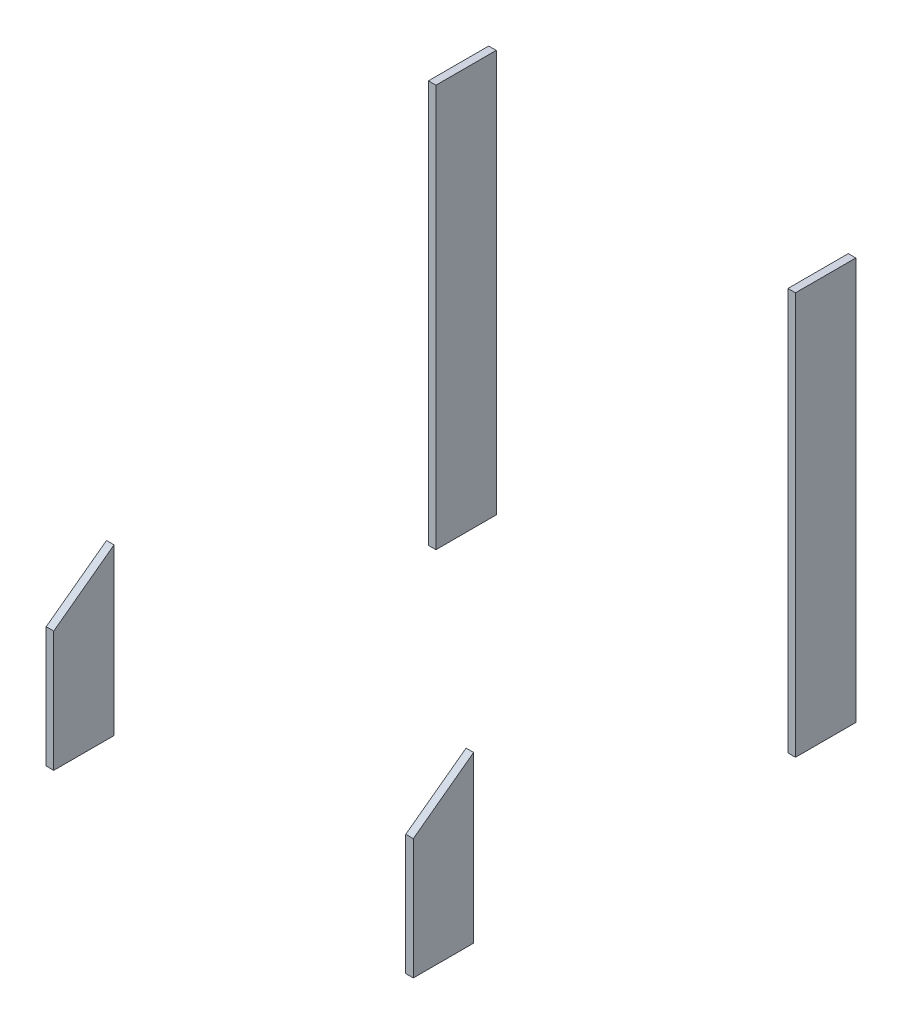
ISO-10303-21;
HEADER;
FILE_DESCRIPTION(('STEP AP214'),'2;1');
FILE_NAME('part.step','',(''),(''),'','','');
FILE_SCHEMA(('AUTOMOTIVE_DESIGN { 1 0 10303 214 1 1 1 1 }'));
ENDSEC;
DATA;
#1=APPLICATION_CONTEXT('core data for automotive mechanical design processes');
#2=APPLICATION_PROTOCOL_DEFINITION('international standard','automotive_design',2000,#1);
#3=PRODUCT_CONTEXT('',#1,'mechanical');
#4=PRODUCT('Part','Part','',(#3));
#5=PRODUCT_RELATED_PRODUCT_CATEGORY('part','',(#4));
#6=PRODUCT_DEFINITION_FORMATION('','',#4);
#7=PRODUCT_DEFINITION_CONTEXT('part definition',#1,'design');
#8=PRODUCT_DEFINITION('design','',#6,#7);
#9=PRODUCT_DEFINITION_SHAPE('','',#8);
#10=(LENGTH_UNIT() NAMED_UNIT(*) SI_UNIT(.MILLI.,.METRE.));
#11=(NAMED_UNIT(*) PLANE_ANGLE_UNIT() SI_UNIT($,.RADIAN.));
#12=(NAMED_UNIT(*) SI_UNIT($,.STERADIAN.) SOLID_ANGLE_UNIT());
#13=UNCERTAINTY_MEASURE_WITH_UNIT(LENGTH_MEASURE(1.E-05),#10,'distance_accuracy_value','');
#14=(GEOMETRIC_REPRESENTATION_CONTEXT(3) GLOBAL_UNCERTAINTY_ASSIGNED_CONTEXT((#13)) GLOBAL_UNIT_ASSIGNED_CONTEXT((#10,
#11,#12)) REPRESENTATION_CONTEXT('',''));
#15=CARTESIAN_POINT('',(0.,0.,0.));
#16=DIRECTION('',(0.,0.,1.));
#17=DIRECTION('',(1.,0.,0.));
#18=AXIS2_PLACEMENT_3D('',#15,#16,#17);
#19=CARTESIAN_POINT('',(231.775,254.,279.4));
#20=DIRECTION('',(-1.,0.,0.));
#21=DIRECTION('',(0.,0.,1.));
#22=AXIS2_PLACEMENT_3D('',#19,#20,#21);
#23=PLANE('',#22);
#24=DIRECTION('',(0.,0.59319903804985,-0.805055837353368));
#25=VECTOR('',#24,1.);
#26=CARTESIAN_POINT('',(231.775,254.,38.1));
#27=LINE('',#26,#25);
#28=CARTESIAN_POINT('',(231.775,76.2,279.4));
#29=VERTEX_POINT('',#28);
#30=CARTESIAN_POINT('',(231.775,104.273684210526,241.3));
#31=VERTEX_POINT('',#30);
#32=EDGE_CURVE('E95',#29,#31,#27,.T.);
#33=ORIENTED_EDGE('',*,*,#32,.F.);
#34=DIRECTION('',(0.,-1.,0.));
#35=VECTOR('',#34,1.);
#36=CARTESIAN_POINT('',(231.775,254.,279.4));
#37=LINE('',#36,#35);
#38=CARTESIAN_POINT('',(231.775,0.,279.4));
#39=VERTEX_POINT('',#38);
#40=EDGE_CURVE('E101',#29,#39,#37,.T.);
#41=ORIENTED_EDGE('',*,*,#40,.T.);
#42=DIRECTION('',(0.,0.,-1.));
#43=VECTOR('',#42,1.);
#44=CARTESIAN_POINT('',(231.775,0.,279.4));
#45=LINE('',#44,#43);
#46=CARTESIAN_POINT('',(231.775,0.,241.3));
#47=VERTEX_POINT('',#46);
#48=EDGE_CURVE('E12',#39,#47,#45,.T.);
#49=ORIENTED_EDGE('',*,*,#48,.T.);
#50=DIRECTION('',(0.,-1.,0.));
#51=VECTOR('',#50,1.);
#52=CARTESIAN_POINT('',(231.775,254.,241.3));
#53=LINE('',#52,#51);
#54=EDGE_CURVE('E75',#31,#47,#53,.T.);
#55=ORIENTED_EDGE('',*,*,#54,.F.);
#56=EDGE_LOOP('',(#33,#41,#49,#55));
#57=FACE_BOUND('',#56,.T.);
#58=ADVANCED_FACE('F52',(#57),#23,.F.);
#59=CARTESIAN_POINT('',(231.775,254.,241.3));
#60=DIRECTION('',(0.,0.,1.));
#61=DIRECTION('',(1.,0.,0.));
#62=AXIS2_PLACEMENT_3D('',#59,#60,#61);
#63=PLANE('',#62);
#64=DIRECTION('',(-1.,0.,0.));
#65=VECTOR('',#64,1.);
#66=CARTESIAN_POINT('',(231.775,104.273684210526,241.3));
#67=LINE('',#66,#65);
#68=CARTESIAN_POINT('',(227.0125,104.273684210526,241.3));
#69=VERTEX_POINT('',#68);
#70=EDGE_CURVE('E123',#31,#69,#67,.T.);
#71=ORIENTED_EDGE('',*,*,#70,.F.);
#72=ORIENTED_EDGE('',*,*,#54,.T.);
#73=DIRECTION('',(-1.,0.,0.));
#74=VECTOR('',#73,1.);
#75=CARTESIAN_POINT('',(231.775,0.,241.3));
#76=LINE('',#75,#74);
#77=CARTESIAN_POINT('',(227.0125,0.,241.3));
#78=VERTEX_POINT('',#77);
#79=EDGE_CURVE('E60',#47,#78,#76,.T.);
#80=ORIENTED_EDGE('',*,*,#79,.T.);
#81=DIRECTION('',(0.,-1.,0.));
#82=VECTOR('',#81,1.);
#83=CARTESIAN_POINT('',(227.0125,254.,241.3));
#84=LINE('',#83,#82);
#85=EDGE_CURVE('E112',#69,#78,#84,.T.);
#86=ORIENTED_EDGE('',*,*,#85,.F.);
#87=EDGE_LOOP('',(#71,#72,#80,#86));
#88=FACE_BOUND('',#87,.T.);
#89=ADVANCED_FACE('F119',(#88),#63,.F.);
#90=CARTESIAN_POINT('',(227.0125,254.,279.4));
#91=DIRECTION('',(1.,0.,0.));
#92=DIRECTION('',(0.,0.,-1.));
#93=AXIS2_PLACEMENT_3D('',#90,#91,#92);
#94=PLANE('',#93);
#95=DIRECTION('',(0.,-0.59319903804985,0.805055837353368));
#96=VECTOR('',#95,1.);
#97=CARTESIAN_POINT('',(227.0125,138.765170556553,194.49012567325));
#98=LINE('',#97,#96);
#99=CARTESIAN_POINT('',(227.0125,76.1999999999999,279.4));
#100=VERTEX_POINT('',#99);
#101=EDGE_CURVE('E67',#69,#100,#98,.T.);
#102=ORIENTED_EDGE('',*,*,#101,.F.);
#103=ORIENTED_EDGE('',*,*,#85,.T.);
#104=DIRECTION('',(0.,0.,1.));
#105=VECTOR('',#104,1.);
#106=CARTESIAN_POINT('',(227.0125,0.,279.4));
#107=LINE('',#106,#105);
#108=CARTESIAN_POINT('',(227.0125,0.,279.4));
#109=VERTEX_POINT('',#108);
#110=EDGE_CURVE('E110',#78,#109,#107,.T.);
#111=ORIENTED_EDGE('',*,*,#110,.T.);
#112=DIRECTION('',(0.,-1.,0.));
#113=VECTOR('',#112,1.);
#114=CARTESIAN_POINT('',(227.0125,254.,279.4));
#115=LINE('',#114,#113);
#116=EDGE_CURVE('E108',#100,#109,#115,.T.);
#117=ORIENTED_EDGE('',*,*,#116,.F.);
#118=EDGE_LOOP('',(#102,#103,#111,#117));
#119=FACE_BOUND('',#118,.T.);
#120=ADVANCED_FACE('F122',(#119),#94,.F.);
#121=CARTESIAN_POINT('',(231.775,254.,279.4));
#122=DIRECTION('',(0.,0.,-1.));
#123=DIRECTION('',(-1.,0.,0.));
#124=AXIS2_PLACEMENT_3D('',#121,#122,#123);
#125=PLANE('',#124);
#126=DIRECTION('',(-1.,0.,0.));
#127=VECTOR('',#126,1.);
#128=CARTESIAN_POINT('',(231.775,76.2,279.4));
#129=LINE('',#128,#127);
#130=EDGE_CURVE('E92',#29,#100,#129,.T.);
#131=ORIENTED_EDGE('',*,*,#130,.T.);
#132=ORIENTED_EDGE('',*,*,#116,.T.);
#133=DIRECTION('',(1.,0.,0.));
#134=VECTOR('',#133,1.);
#135=CARTESIAN_POINT('',(231.775,0.,279.4));
#136=LINE('',#135,#134);
#137=EDGE_CURVE('E106',#109,#39,#136,.T.);
#138=ORIENTED_EDGE('',*,*,#137,.T.);
#139=ORIENTED_EDGE('',*,*,#40,.F.);
#140=EDGE_LOOP('',(#131,#132,#138,#139));
#141=FACE_BOUND('',#140,.T.);
#142=ADVANCED_FACE('F104',(#141),#125,.F.);
#143=CARTESIAN_POINT('',(0.,0.,0.));
#144=DIRECTION('',(0.,1.,0.));
#145=DIRECTION('',(0.,0.,1.));
#146=AXIS2_PLACEMENT_3D('',#143,#144,#145);
#147=PLANE('',#146);
#148=ORIENTED_EDGE('',*,*,#48,.F.);
#149=ORIENTED_EDGE('',*,*,#137,.F.);
#150=ORIENTED_EDGE('',*,*,#110,.F.);
#151=ORIENTED_EDGE('',*,*,#79,.F.);
#152=EDGE_LOOP('',(#148,#149,#150,#151));
#153=FACE_BOUND('',#152,.T.);
#154=ADVANCED_FACE('F54',(#153),#147,.F.);
#155=CARTESIAN_POINT('',(231.775,254.,38.1));
#156=DIRECTION('',(0.,0.805055837353368,0.59319903804985));
#157=DIRECTION('',(0.,-0.59319903804985,0.805055837353368));
#158=AXIS2_PLACEMENT_3D('',#155,#156,#157);
#159=PLANE('',#158);
#160=ORIENTED_EDGE('',*,*,#70,.T.);
#161=ORIENTED_EDGE('',*,*,#101,.T.);
#162=ORIENTED_EDGE('',*,*,#130,.F.);
#163=ORIENTED_EDGE('',*,*,#32,.T.);
#164=EDGE_LOOP('',(#160,#161,#162,#163));
#165=FACE_BOUND('',#164,.T.);
#166=ADVANCED_FACE('F94',(#165),#159,.T.);
#167=CLOSED_SHELL('',(#58,#89,#120,#142,#154,#166));
#168=MANIFOLD_SOLID_BREP('B2',#167);
#169=CARTESIAN_POINT('',(0.,254.,279.4));
#170=DIRECTION('',(1.,0.,0.));
#171=DIRECTION('',(0.,0.,-1.));
#172=AXIS2_PLACEMENT_3D('',#169,#170,#171);
#173=PLANE('',#172);
#174=DIRECTION('',(0.,0.59319903804985,-0.805055837353368));
#175=VECTOR('',#174,1.);
#176=CARTESIAN_POINT('',(0.,254.,38.1));
#177=LINE('',#176,#175);
#178=CARTESIAN_POINT('',(0.,76.2,279.4));
#179=VERTEX_POINT('',#178);
#180=CARTESIAN_POINT('',(0.,104.273684210526,241.3));
#181=VERTEX_POINT('',#180);
#182=EDGE_CURVE('E238',#179,#181,#177,.T.);
#183=ORIENTED_EDGE('',*,*,#182,.T.);
#184=DIRECTION('',(0.,-1.,0.));
#185=VECTOR('',#184,1.);
#186=CARTESIAN_POINT('',(0.,254.,241.3));
#187=LINE('',#186,#185);
#188=CARTESIAN_POINT('',(0.,0.,241.3));
#189=VERTEX_POINT('',#188);
#190=EDGE_CURVE('E256',#181,#189,#187,.T.);
#191=ORIENTED_EDGE('',*,*,#190,.T.);
#192=DIRECTION('',(0.,0.,1.));
#193=VECTOR('',#192,1.);
#194=CARTESIAN_POINT('',(0.,0.,279.4));
#195=LINE('',#194,#193);
#196=CARTESIAN_POINT('',(0.,0.,279.4));
#197=VERTEX_POINT('',#196);
#198=EDGE_CURVE('E206',#189,#197,#195,.T.);
#199=ORIENTED_EDGE('',*,*,#198,.T.);
#200=DIRECTION('',(0.,-1.,0.));
#201=VECTOR('',#200,1.);
#202=CARTESIAN_POINT('',(0.,254.,279.4));
#203=LINE('',#202,#201);
#204=EDGE_CURVE('E220',#179,#197,#203,.T.);
#205=ORIENTED_EDGE('',*,*,#204,.F.);
#206=EDGE_LOOP('',(#183,#191,#199,#205));
#207=FACE_BOUND('',#206,.T.);
#208=ADVANCED_FACE('F198',(#207),#173,.F.);
#209=CARTESIAN_POINT('',(0.,254.,279.4));
#210=DIRECTION('',(0.,0.,-1.));
#211=DIRECTION('',(-1.,0.,0.));
#212=AXIS2_PLACEMENT_3D('',#209,#210,#211);
#213=PLANE('',#212);
#214=DIRECTION('',(-1.,0.,0.));
#215=VECTOR('',#214,1.);
#216=CARTESIAN_POINT('',(231.775,76.2,279.4));
#217=LINE('',#216,#215);
#218=CARTESIAN_POINT('',(4.76250000000003,76.2,279.4));
#219=VERTEX_POINT('',#218);
#220=EDGE_CURVE('E240',#219,#179,#217,.T.);
#221=ORIENTED_EDGE('',*,*,#220,.T.);
#222=ORIENTED_EDGE('',*,*,#204,.T.);
#223=DIRECTION('',(1.,0.,0.));
#224=VECTOR('',#223,1.);
#225=CARTESIAN_POINT('',(0.,0.,279.4));
#226=LINE('',#225,#224);
#227=CARTESIAN_POINT('',(4.76250000000004,0.,279.4));
#228=VERTEX_POINT('',#227);
#229=EDGE_CURVE('E264',#197,#228,#226,.T.);
#230=ORIENTED_EDGE('',*,*,#229,.T.);
#231=DIRECTION('',(0.,-1.,0.));
#232=VECTOR('',#231,1.);
#233=CARTESIAN_POINT('',(4.76250000000004,254.,279.4));
#234=LINE('',#233,#232);
#235=EDGE_CURVE('E246',#219,#228,#234,.T.);
#236=ORIENTED_EDGE('',*,*,#235,.F.);
#237=EDGE_LOOP('',(#221,#222,#230,#236));
#238=FACE_BOUND('',#237,.T.);
#239=ADVANCED_FACE('F245',(#238),#213,.F.);
#240=CARTESIAN_POINT('',(4.76250000000004,254.,279.4));
#241=DIRECTION('',(-1.,0.,0.));
#242=DIRECTION('',(0.,0.,1.));
#243=AXIS2_PLACEMENT_3D('',#240,#241,#242);
#244=PLANE('',#243);
#245=DIRECTION('',(0.,0.59319903804985,-0.805055837353368));
#246=VECTOR('',#245,1.);
#247=CARTESIAN_POINT('',(4.76250000000014,138.765170556553,194.49012567325));
#248=LINE('',#247,#246);
#249=CARTESIAN_POINT('',(4.76250000000008,104.273684210526,241.3));
#250=VERTEX_POINT('',#249);
#251=EDGE_CURVE('E212',#219,#250,#248,.T.);
#252=ORIENTED_EDGE('',*,*,#251,.F.);
#253=ORIENTED_EDGE('',*,*,#235,.T.);
#254=DIRECTION('',(0.,0.,-1.));
#255=VECTOR('',#254,1.);
#256=CARTESIAN_POINT('',(4.76250000000004,0.,279.4));
#257=LINE('',#256,#255);
#258=CARTESIAN_POINT('',(4.76250000000008,0.,241.3));
#259=VERTEX_POINT('',#258);
#260=EDGE_CURVE('E261',#228,#259,#257,.T.);
#261=ORIENTED_EDGE('',*,*,#260,.T.);
#262=DIRECTION('',(0.,-1.,0.));
#263=VECTOR('',#262,1.);
#264=CARTESIAN_POINT('',(4.76250000000008,254.,241.3));
#265=LINE('',#264,#263);
#266=EDGE_CURVE('E251',#250,#259,#265,.T.);
#267=ORIENTED_EDGE('',*,*,#266,.F.);
#268=EDGE_LOOP('',(#252,#253,#261,#267));
#269=FACE_BOUND('',#268,.T.);
#270=ADVANCED_FACE('F270',(#269),#244,.F.);
#271=CARTESIAN_POINT('',(0.,254.,241.3));
#272=DIRECTION('',(0.,0.,1.));
#273=DIRECTION('',(1.,0.,0.));
#274=AXIS2_PLACEMENT_3D('',#271,#272,#273);
#275=PLANE('',#274);
#276=DIRECTION('',(-1.,0.,0.));
#277=VECTOR('',#276,1.);
#278=CARTESIAN_POINT('',(0.,104.273684210526,241.3));
#279=LINE('',#278,#277);
#280=EDGE_CURVE('E50',#250,#181,#279,.T.);
#281=ORIENTED_EDGE('',*,*,#280,.F.);
#282=ORIENTED_EDGE('',*,*,#266,.T.);
#283=DIRECTION('',(-1.,0.,0.));
#284=VECTOR('',#283,1.);
#285=CARTESIAN_POINT('',(0.,0.,241.3));
#286=LINE('',#285,#284);
#287=EDGE_CURVE('E258',#259,#189,#286,.T.);
#288=ORIENTED_EDGE('',*,*,#287,.T.);
#289=ORIENTED_EDGE('',*,*,#190,.F.);
#290=EDGE_LOOP('',(#281,#282,#288,#289));
#291=FACE_BOUND('',#290,.T.);
#292=ADVANCED_FACE('F272',(#291),#275,.F.);
#293=CARTESIAN_POINT('',(0.,0.,0.));
#294=DIRECTION('',(0.,-1.,0.));
#295=DIRECTION('',(0.,0.,-1.));
#296=AXIS2_PLACEMENT_3D('',#293,#294,#295);
#297=PLANE('',#296);
#298=ORIENTED_EDGE('',*,*,#198,.F.);
#299=ORIENTED_EDGE('',*,*,#287,.F.);
#300=ORIENTED_EDGE('',*,*,#260,.F.);
#301=ORIENTED_EDGE('',*,*,#229,.F.);
#302=EDGE_LOOP('',(#298,#299,#300,#301));
#303=FACE_BOUND('',#302,.T.);
#304=ADVANCED_FACE('F200',(#303),#297,.T.);
#305=CARTESIAN_POINT('',(231.775,254.,38.1));
#306=DIRECTION('',(0.,0.805055837353368,0.59319903804985));
#307=DIRECTION('',(0.,-0.59319903804985,0.805055837353368));
#308=AXIS2_PLACEMENT_3D('',#305,#306,#307);
#309=PLANE('',#308);
#310=ORIENTED_EDGE('',*,*,#251,.T.);
#311=ORIENTED_EDGE('',*,*,#280,.T.);
#312=ORIENTED_EDGE('',*,*,#182,.F.);
#313=ORIENTED_EDGE('',*,*,#220,.F.);
#314=EDGE_LOOP('',(#310,#311,#312,#313));
#315=FACE_BOUND('',#314,.T.);
#316=ADVANCED_FACE('F239',(#315),#309,.T.);
#317=CLOSED_SHELL('',(#208,#239,#270,#292,#304,#316));
#318=MANIFOLD_SOLID_BREP('B6',#317);
#319=CARTESIAN_POINT('',(231.775,254.,0.));
#320=DIRECTION('',(-1.,0.,0.));
#321=DIRECTION('',(0.,0.,1.));
#322=AXIS2_PLACEMENT_3D('',#319,#320,#321);
#323=PLANE('',#322);
#324=DIRECTION('',(0.,0.,-1.));
#325=VECTOR('',#324,1.);
#326=CARTESIAN_POINT('',(231.775,0.,0.));
#327=LINE('',#326,#325);
#328=CARTESIAN_POINT('',(231.775,0.,38.1));
#329=VERTEX_POINT('',#328);
#330=CARTESIAN_POINT('',(231.775,0.,0.));
#331=VERTEX_POINT('',#330);
#332=EDGE_CURVE('E196',#329,#331,#327,.T.);
#333=ORIENTED_EDGE('',*,*,#332,.T.);
#334=DIRECTION('',(0.,-1.,0.));
#335=VECTOR('',#334,1.);
#336=CARTESIAN_POINT('',(231.775,254.,0.));
#337=LINE('',#336,#335);
#338=CARTESIAN_POINT('',(231.775,254.,0.));
#339=VERTEX_POINT('',#338);
#340=EDGE_CURVE('E414',#339,#331,#337,.T.);
#341=ORIENTED_EDGE('',*,*,#340,.F.);
#342=DIRECTION('',(0.,0.,-1.));
#343=VECTOR('',#342,1.);
#344=CARTESIAN_POINT('',(231.775,254.,0.));
#345=LINE('',#344,#343);
#346=CARTESIAN_POINT('',(231.775,254.,38.1));
#347=VERTEX_POINT('',#346);
#348=EDGE_CURVE('E347',#347,#339,#345,.T.);
#349=ORIENTED_EDGE('',*,*,#348,.F.);
#350=DIRECTION('',(0.,-1.,0.));
#351=VECTOR('',#350,1.);
#352=CARTESIAN_POINT('',(231.775,254.,38.1));
#353=LINE('',#352,#351);
#354=EDGE_CURVE('E402',#347,#329,#353,.T.);
#355=ORIENTED_EDGE('',*,*,#354,.T.);
#356=EDGE_LOOP('',(#333,#341,#349,#355));
#357=FACE_BOUND('',#356,.T.);
#358=ADVANCED_FACE('F343',(#357),#323,.F.);
#359=CARTESIAN_POINT('',(231.775,254.,0.));
#360=DIRECTION('',(0.,0.,1.));
#361=DIRECTION('',(1.,0.,0.));
#362=AXIS2_PLACEMENT_3D('',#359,#360,#361);
#363=PLANE('',#362);
#364=DIRECTION('',(-1.,0.,0.));
#365=VECTOR('',#364,1.);
#366=CARTESIAN_POINT('',(231.775,0.,0.));
#367=LINE('',#366,#365);
#368=CARTESIAN_POINT('',(227.0125,0.,0.));
#369=VERTEX_POINT('',#368);
#370=EDGE_CURVE('E353',#331,#369,#367,.T.);
#371=ORIENTED_EDGE('',*,*,#370,.T.);
#372=DIRECTION('',(0.,-1.,0.));
#373=VECTOR('',#372,1.);
#374=CARTESIAN_POINT('',(227.0125,254.,0.));
#375=LINE('',#374,#373);
#376=CARTESIAN_POINT('',(227.0125,254.,0.));
#377=VERTEX_POINT('',#376);
#378=EDGE_CURVE('E398',#377,#369,#375,.T.);
#379=ORIENTED_EDGE('',*,*,#378,.F.);
#380=DIRECTION('',(-1.,0.,0.));
#381=VECTOR('',#380,1.);
#382=CARTESIAN_POINT('',(231.775,254.,0.));
#383=LINE('',#382,#381);
#384=EDGE_CURVE('E377',#339,#377,#383,.T.);
#385=ORIENTED_EDGE('',*,*,#384,.F.);
#386=ORIENTED_EDGE('',*,*,#340,.T.);
#387=EDGE_LOOP('',(#371,#379,#385,#386));
#388=FACE_BOUND('',#387,.T.);
#389=ADVANCED_FACE('F417',(#388),#363,.F.);
#390=CARTESIAN_POINT('',(227.0125,254.,0.));
#391=DIRECTION('',(1.,0.,0.));
#392=DIRECTION('',(0.,0.,-1.));
#393=AXIS2_PLACEMENT_3D('',#390,#391,#392);
#394=PLANE('',#393);
#395=DIRECTION('',(0.,0.,1.));
#396=VECTOR('',#395,1.);
#397=CARTESIAN_POINT('',(227.0125,0.,0.));
#398=LINE('',#397,#396);
#399=CARTESIAN_POINT('',(227.0125,0.,38.1));
#400=VERTEX_POINT('',#399);
#401=EDGE_CURVE('E393',#369,#400,#398,.T.);
#402=ORIENTED_EDGE('',*,*,#401,.T.);
#403=DIRECTION('',(0.,-1.,0.));
#404=VECTOR('',#403,1.);
#405=CARTESIAN_POINT('',(227.0125,254.,38.1));
#406=LINE('',#405,#404);
#407=CARTESIAN_POINT('',(227.0125,254.,38.1));
#408=VERTEX_POINT('',#407);
#409=EDGE_CURVE('E396',#408,#400,#406,.T.);
#410=ORIENTED_EDGE('',*,*,#409,.F.);
#411=DIRECTION('',(0.,0.,1.));
#412=VECTOR('',#411,1.);
#413=CARTESIAN_POINT('',(227.0125,254.,0.));
#414=LINE('',#413,#412);
#415=EDGE_CURVE('E410',#377,#408,#414,.T.);
#416=ORIENTED_EDGE('',*,*,#415,.F.);
#417=ORIENTED_EDGE('',*,*,#378,.T.);
#418=EDGE_LOOP('',(#402,#410,#416,#417));
#419=FACE_BOUND('',#418,.T.);
#420=ADVANCED_FACE('F394',(#419),#394,.F.);
#421=CARTESIAN_POINT('',(231.775,254.,38.1));
#422=DIRECTION('',(0.,0.,-1.));
#423=DIRECTION('',(-1.,0.,0.));
#424=AXIS2_PLACEMENT_3D('',#421,#422,#423);
#425=PLANE('',#424);
#426=DIRECTION('',(1.,0.,0.));
#427=VECTOR('',#426,1.);
#428=CARTESIAN_POINT('',(231.775,0.,38.1));
#429=LINE('',#428,#427);
#430=EDGE_CURVE('E387',#400,#329,#429,.T.);
#431=ORIENTED_EDGE('',*,*,#430,.T.);
#432=ORIENTED_EDGE('',*,*,#354,.F.);
#433=DIRECTION('',(1.,0.,0.));
#434=VECTOR('',#433,1.);
#435=CARTESIAN_POINT('',(231.775,254.,38.1));
#436=LINE('',#435,#434);
#437=EDGE_CURVE('E401',#408,#347,#436,.T.);
#438=ORIENTED_EDGE('',*,*,#437,.F.);
#439=ORIENTED_EDGE('',*,*,#409,.T.);
#440=EDGE_LOOP('',(#431,#432,#438,#439));
#441=FACE_BOUND('',#440,.T.);
#442=ADVANCED_FACE('F400',(#441),#425,.F.);
#443=CARTESIAN_POINT('',(0.,254.,0.));
#444=DIRECTION('',(0.,-1.,0.));
#445=DIRECTION('',(0.,0.,-1.));
#446=AXIS2_PLACEMENT_3D('',#443,#444,#445);
#447=PLANE('',#446);
#448=ORIENTED_EDGE('',*,*,#348,.T.);
#449=ORIENTED_EDGE('',*,*,#384,.T.);
#450=ORIENTED_EDGE('',*,*,#415,.T.);
#451=ORIENTED_EDGE('',*,*,#437,.T.);
#452=EDGE_LOOP('',(#448,#449,#450,#451));
#453=FACE_BOUND('',#452,.T.);
#454=ADVANCED_FACE('F345',(#453),#447,.F.);
#455=CARTESIAN_POINT('',(0.,0.,0.));
#456=DIRECTION('',(0.,-1.,0.));
#457=DIRECTION('',(0.,0.,-1.));
#458=AXIS2_PLACEMENT_3D('',#455,#456,#457);
#459=PLANE('',#458);
#460=ORIENTED_EDGE('',*,*,#332,.F.);
#461=ORIENTED_EDGE('',*,*,#430,.F.);
#462=ORIENTED_EDGE('',*,*,#401,.F.);
#463=ORIENTED_EDGE('',*,*,#370,.F.);
#464=EDGE_LOOP('',(#460,#461,#462,#463));
#465=FACE_BOUND('',#464,.T.);
#466=ADVANCED_FACE('F404',(#465),#459,.T.);
#467=CLOSED_SHELL('',(#358,#389,#420,#442,#454,#466));
#468=MANIFOLD_SOLID_BREP('B44',#467);
#469=CARTESIAN_POINT('',(0.,254.,0.));
#470=DIRECTION('',(1.,0.,0.));
#471=DIRECTION('',(0.,0.,-1.));
#472=AXIS2_PLACEMENT_3D('',#469,#470,#471);
#473=PLANE('',#472);
#474=DIRECTION('',(0.,0.,1.));
#475=VECTOR('',#474,1.);
#476=CARTESIAN_POINT('',(0.,0.,0.));
#477=LINE('',#476,#475);
#478=CARTESIAN_POINT('',(0.,0.,0.));
#479=VERTEX_POINT('',#478);
#480=CARTESIAN_POINT('',(0.,0.,38.1));
#481=VERTEX_POINT('',#480);
#482=EDGE_CURVE('E542',#479,#481,#477,.T.);
#483=ORIENTED_EDGE('',*,*,#482,.T.);
#484=DIRECTION('',(0.,-1.,0.));
#485=VECTOR('',#484,1.);
#486=CARTESIAN_POINT('',(0.,254.,38.1));
#487=LINE('',#486,#485);
#488=CARTESIAN_POINT('',(0.,254.,38.1));
#489=VERTEX_POINT('',#488);
#490=EDGE_CURVE('E341',#489,#481,#487,.T.);
#491=ORIENTED_EDGE('',*,*,#490,.F.);
#492=DIRECTION('',(0.,0.,1.));
#493=VECTOR('',#492,1.);
#494=CARTESIAN_POINT('',(0.,254.,0.));
#495=LINE('',#494,#493);
#496=CARTESIAN_POINT('',(0.,254.,0.));
#497=VERTEX_POINT('',#496);
#498=EDGE_CURVE('E530',#497,#489,#495,.T.);
#499=ORIENTED_EDGE('',*,*,#498,.F.);
#500=DIRECTION('',(0.,-1.,0.));
#501=VECTOR('',#500,1.);
#502=CARTESIAN_POINT('',(0.,254.,0.));
#503=LINE('',#502,#501);
#504=EDGE_CURVE('E538',#497,#479,#503,.T.);
#505=ORIENTED_EDGE('',*,*,#504,.T.);
#506=EDGE_LOOP('',(#483,#491,#499,#505));
#507=FACE_BOUND('',#506,.T.);
#508=ADVANCED_FACE('F479',(#507),#473,.F.);
#509=CARTESIAN_POINT('',(0.,254.,38.1));
#510=DIRECTION('',(0.,0.,-1.));
#511=DIRECTION('',(-1.,0.,0.));
#512=AXIS2_PLACEMENT_3D('',#509,#510,#511);
#513=PLANE('',#512);
#514=DIRECTION('',(1.,0.,0.));
#515=VECTOR('',#514,1.);
#516=CARTESIAN_POINT('',(0.,0.,38.1));
#517=LINE('',#516,#515);
#518=CARTESIAN_POINT('',(4.76250000000001,0.,38.1));
#519=VERTEX_POINT('',#518);
#520=EDGE_CURVE('E534',#481,#519,#517,.T.);
#521=ORIENTED_EDGE('',*,*,#520,.T.);
#522=DIRECTION('',(0.,-1.,0.));
#523=VECTOR('',#522,1.);
#524=CARTESIAN_POINT('',(4.76250000000001,254.,38.1));
#525=LINE('',#524,#523);
#526=CARTESIAN_POINT('',(4.76250000000001,254.,38.1));
#527=VERTEX_POINT('',#526);
#528=EDGE_CURVE('E487',#527,#519,#525,.T.);
#529=ORIENTED_EDGE('',*,*,#528,.F.);
#530=DIRECTION('',(1.,0.,0.));
#531=VECTOR('',#530,1.);
#532=CARTESIAN_POINT('',(0.,254.,38.1));
#533=LINE('',#532,#531);
#534=EDGE_CURVE('E525',#489,#527,#533,.T.);
#535=ORIENTED_EDGE('',*,*,#534,.F.);
#536=ORIENTED_EDGE('',*,*,#490,.T.);
#537=EDGE_LOOP('',(#521,#529,#535,#536));
#538=FACE_BOUND('',#537,.T.);
#539=ADVANCED_FACE('F533',(#538),#513,.F.);
#540=CARTESIAN_POINT('',(4.7625,254.,0.));
#541=DIRECTION('',(-1.,0.,0.));
#542=DIRECTION('',(0.,0.,1.));
#543=AXIS2_PLACEMENT_3D('',#540,#541,#542);
#544=PLANE('',#543);
#545=DIRECTION('',(0.,0.,-1.));
#546=VECTOR('',#545,1.);
#547=CARTESIAN_POINT('',(4.7625,0.,0.));
#548=LINE('',#547,#546);
#549=CARTESIAN_POINT('',(4.7625,0.,0.));
#550=VERTEX_POINT('',#549);
#551=EDGE_CURVE('E512',#519,#550,#548,.T.);
#552=ORIENTED_EDGE('',*,*,#551,.T.);
#553=DIRECTION('',(0.,-1.,0.));
#554=VECTOR('',#553,1.);
#555=CARTESIAN_POINT('',(4.7625,254.,0.));
#556=LINE('',#555,#554);
#557=CARTESIAN_POINT('',(4.7625,254.,0.));
#558=VERTEX_POINT('',#557);
#559=EDGE_CURVE('E535',#558,#550,#556,.T.);
#560=ORIENTED_EDGE('',*,*,#559,.F.);
#561=DIRECTION('',(0.,0.,-1.));
#562=VECTOR('',#561,1.);
#563=CARTESIAN_POINT('',(4.7625,254.,0.));
#564=LINE('',#563,#562);
#565=EDGE_CURVE('E528',#527,#558,#564,.T.);
#566=ORIENTED_EDGE('',*,*,#565,.F.);
#567=ORIENTED_EDGE('',*,*,#528,.T.);
#568=EDGE_LOOP('',(#552,#560,#566,#567));
#569=FACE_BOUND('',#568,.T.);
#570=ADVANCED_FACE('F536',(#569),#544,.F.);
#571=CARTESIAN_POINT('',(0.,254.,0.));
#572=DIRECTION('',(0.,0.,1.));
#573=DIRECTION('',(1.,0.,0.));
#574=AXIS2_PLACEMENT_3D('',#571,#572,#573);
#575=PLANE('',#574);
#576=DIRECTION('',(-1.,0.,0.));
#577=VECTOR('',#576,1.);
#578=CARTESIAN_POINT('',(0.,0.,0.));
#579=LINE('',#578,#577);
#580=EDGE_CURVE('E518',#550,#479,#579,.T.);
#581=ORIENTED_EDGE('',*,*,#580,.T.);
#582=ORIENTED_EDGE('',*,*,#504,.F.);
#583=DIRECTION('',(-1.,0.,0.));
#584=VECTOR('',#583,1.);
#585=CARTESIAN_POINT('',(0.,254.,0.));
#586=LINE('',#585,#584);
#587=EDGE_CURVE('E495',#558,#497,#586,.T.);
#588=ORIENTED_EDGE('',*,*,#587,.F.);
#589=ORIENTED_EDGE('',*,*,#559,.T.);
#590=EDGE_LOOP('',(#581,#582,#588,#589));
#591=FACE_BOUND('',#590,.T.);
#592=ADVANCED_FACE('F549',(#591),#575,.F.);
#593=CARTESIAN_POINT('',(0.,254.,0.));
#594=DIRECTION('',(0.,1.,0.));
#595=DIRECTION('',(0.,0.,1.));
#596=AXIS2_PLACEMENT_3D('',#593,#594,#595);
#597=PLANE('',#596);
#598=ORIENTED_EDGE('',*,*,#498,.T.);
#599=ORIENTED_EDGE('',*,*,#534,.T.);
#600=ORIENTED_EDGE('',*,*,#565,.T.);
#601=ORIENTED_EDGE('',*,*,#587,.T.);
#602=EDGE_LOOP('',(#598,#599,#600,#601));
#603=FACE_BOUND('',#602,.T.);
#604=ADVANCED_FACE('F526',(#603),#597,.T.);
#605=CARTESIAN_POINT('',(0.,0.,0.));
#606=DIRECTION('',(0.,1.,0.));
#607=DIRECTION('',(0.,0.,1.));
#608=AXIS2_PLACEMENT_3D('',#605,#606,#607);
#609=PLANE('',#608);
#610=ORIENTED_EDGE('',*,*,#482,.F.);
#611=ORIENTED_EDGE('',*,*,#580,.F.);
#612=ORIENTED_EDGE('',*,*,#551,.F.);
#613=ORIENTED_EDGE('',*,*,#520,.F.);
#614=EDGE_LOOP('',(#610,#611,#612,#613));
#615=FACE_BOUND('',#614,.T.);
#616=ADVANCED_FACE('F552',(#615),#609,.F.);
#617=CLOSED_SHELL('',(#508,#539,#570,#592,#604,#616));
#618=MANIFOLD_SOLID_BREP('B190',#617);
#619=ADVANCED_BREP_SHAPE_REPRESENTATION('',(#18,#168,#318,#468,#618),#14);
#620=SHAPE_DEFINITION_REPRESENTATION(#9,#619);
ENDSEC;
END-ISO-10303-21;
